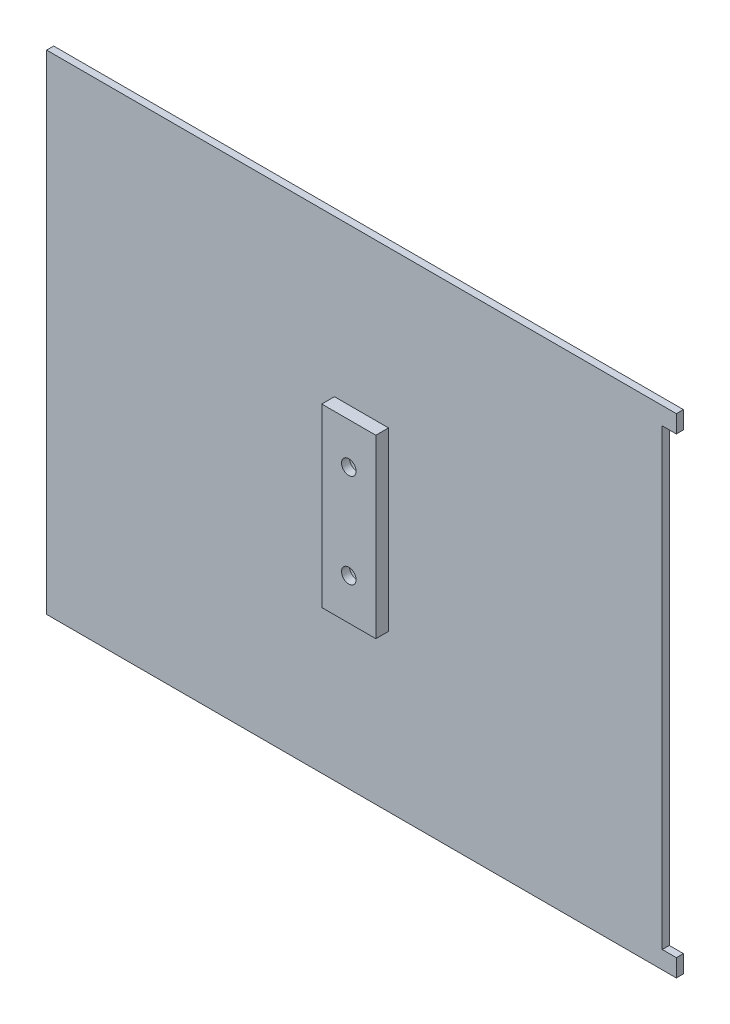
ISO-10303-21;
HEADER;
FILE_DESCRIPTION(('STEP AP214'),'2;1');
FILE_NAME('part.step','',(''),(''),'','','');
FILE_SCHEMA(('AUTOMOTIVE_DESIGN { 1 0 10303 214 1 1 1 1 }'));
ENDSEC;
DATA;
#1=APPLICATION_CONTEXT('core data for automotive mechanical design processes');
#2=APPLICATION_PROTOCOL_DEFINITION('international standard','automotive_design',2000,#1);
#3=PRODUCT_CONTEXT('',#1,'mechanical');
#4=PRODUCT('Part','Part','',(#3));
#5=PRODUCT_RELATED_PRODUCT_CATEGORY('part','',(#4));
#6=PRODUCT_DEFINITION_FORMATION('','',#4);
#7=PRODUCT_DEFINITION_CONTEXT('part definition',#1,'design');
#8=PRODUCT_DEFINITION('design','',#6,#7);
#9=PRODUCT_DEFINITION_SHAPE('','',#8);
#10=(LENGTH_UNIT() NAMED_UNIT(*) SI_UNIT(.MILLI.,.METRE.));
#11=(NAMED_UNIT(*) PLANE_ANGLE_UNIT() SI_UNIT($,.RADIAN.));
#12=(NAMED_UNIT(*) SI_UNIT($,.STERADIAN.) SOLID_ANGLE_UNIT());
#13=UNCERTAINTY_MEASURE_WITH_UNIT(LENGTH_MEASURE(1.E-05),#10,'distance_accuracy_value','');
#14=(GEOMETRIC_REPRESENTATION_CONTEXT(3) GLOBAL_UNCERTAINTY_ASSIGNED_CONTEXT((#13)) GLOBAL_UNIT_ASSIGNED_CONTEXT((#10,
#11,#12)) REPRESENTATION_CONTEXT('',''));
#15=CARTESIAN_POINT('',(0.,0.,0.));
#16=DIRECTION('',(0.,0.,1.));
#17=DIRECTION('',(1.,0.,0.));
#18=AXIS2_PLACEMENT_3D('',#15,#16,#17);
#19=CARTESIAN_POINT('',(0.,0.,1.5));
#20=DIRECTION('',(0.,0.,1.));
#21=DIRECTION('',(1.,0.,0.));
#22=AXIS2_PLACEMENT_3D('',#19,#20,#21);
#23=PLANE('',#22);
#24=DIRECTION('',(-1.,0.,0.));
#25=VECTOR('',#24,1.);
#26=CARTESIAN_POINT('',(0.,-48.2500000000001,1.5));
#27=LINE('',#26,#25);
#28=CARTESIAN_POINT('',(67.,-48.2500000000001,1.5));
#29=VERTEX_POINT('',#28);
#30=CARTESIAN_POINT('',(64.,-48.2500000000001,1.5));
#31=VERTEX_POINT('',#30);
#32=EDGE_CURVE('E161',#29,#31,#27,.T.);
#33=ORIENTED_EDGE('',*,*,#32,.T.);
#34=DIRECTION('',(0.,1.,0.));
#35=VECTOR('',#34,1.);
#36=CARTESIAN_POINT('',(64.,0.,1.5));
#37=LINE('',#36,#35);
#38=CARTESIAN_POINT('',(64.,48.2499999999999,1.5));
#39=VERTEX_POINT('',#38);
#40=EDGE_CURVE('E99',#31,#39,#37,.T.);
#41=ORIENTED_EDGE('',*,*,#40,.T.);
#42=DIRECTION('',(-1.,0.,0.));
#43=VECTOR('',#42,1.);
#44=CARTESIAN_POINT('',(0.,48.2499999999999,1.5));
#45=LINE('',#44,#43);
#46=CARTESIAN_POINT('',(67.,48.2499999999999,1.5));
#47=VERTEX_POINT('',#46);
#48=EDGE_CURVE('E174',#47,#39,#45,.T.);
#49=ORIENTED_EDGE('',*,*,#48,.F.);
#50=DIRECTION('',(0.,1.,0.));
#51=VECTOR('',#50,1.);
#52=CARTESIAN_POINT('',(67.,0.,1.5));
#53=LINE('',#52,#51);
#54=CARTESIAN_POINT('',(67.,52.,1.5));
#55=VERTEX_POINT('',#54);
#56=EDGE_CURVE('E188',#47,#55,#53,.T.);
#57=ORIENTED_EDGE('',*,*,#56,.T.);
#58=DIRECTION('',(-1.,0.,0.));
#59=VECTOR('',#58,1.);
#60=CARTESIAN_POINT('',(0.,52.,1.5));
#61=LINE('',#60,#59);
#62=CARTESIAN_POINT('',(-67.,52.,1.5));
#63=VERTEX_POINT('',#62);
#64=EDGE_CURVE('E133',#55,#63,#61,.T.);
#65=ORIENTED_EDGE('',*,*,#64,.T.);
#66=DIRECTION('',(0.,1.,0.));
#67=VECTOR('',#66,1.);
#68=CARTESIAN_POINT('',(-67.,0.,1.5));
#69=LINE('',#68,#67);
#70=CARTESIAN_POINT('',(-67.,-52.,1.5));
#71=VERTEX_POINT('',#70);
#72=EDGE_CURVE('E120',#71,#63,#69,.T.);
#73=ORIENTED_EDGE('',*,*,#72,.F.);
#74=DIRECTION('',(-1.,0.,0.));
#75=VECTOR('',#74,1.);
#76=CARTESIAN_POINT('',(0.,-52.,1.5));
#77=LINE('',#76,#75);
#78=CARTESIAN_POINT('',(67.,-52.,1.5));
#79=VERTEX_POINT('',#78);
#80=EDGE_CURVE('E131',#79,#71,#77,.T.);
#81=ORIENTED_EDGE('',*,*,#80,.F.);
#82=DIRECTION('',(0.,1.,0.));
#83=VECTOR('',#82,1.);
#84=CARTESIAN_POINT('',(67.,0.,1.5));
#85=LINE('',#84,#83);
#86=EDGE_CURVE('E58',#79,#29,#85,.T.);
#87=ORIENTED_EDGE('',*,*,#86,.T.);
#88=EDGE_LOOP('',(#33,#41,#49,#57,#65,#73,#81,#87));
#89=FACE_BOUND('',#88,.T.);
#90=DIRECTION('',(1.,0.,0.));
#91=VECTOR('',#90,1.);
#92=CARTESIAN_POINT('',(5.75,-18.75,1.5));
#93=LINE('',#92,#91);
#94=CARTESIAN_POINT('',(-5.75,-18.75,1.5));
#95=VERTEX_POINT('',#94);
#96=CARTESIAN_POINT('',(5.75,-18.75,1.5));
#97=VERTEX_POINT('',#96);
#98=EDGE_CURVE('E209',#95,#97,#93,.T.);
#99=ORIENTED_EDGE('',*,*,#98,.F.);
#100=DIRECTION('',(0.,-1.,0.));
#101=VECTOR('',#100,1.);
#102=CARTESIAN_POINT('',(-5.75,-18.75,1.5));
#103=LINE('',#102,#101);
#104=CARTESIAN_POINT('',(-5.75,18.75,1.5));
#105=VERTEX_POINT('',#104);
#106=EDGE_CURVE('E212',#105,#95,#103,.T.);
#107=ORIENTED_EDGE('',*,*,#106,.F.);
#108=DIRECTION('',(-1.,0.,0.));
#109=VECTOR('',#108,1.);
#110=CARTESIAN_POINT('',(5.75,18.75,1.5));
#111=LINE('',#110,#109);
#112=CARTESIAN_POINT('',(5.75,18.75,1.5));
#113=VERTEX_POINT('',#112);
#114=EDGE_CURVE('E204',#113,#105,#111,.T.);
#115=ORIENTED_EDGE('',*,*,#114,.F.);
#116=DIRECTION('',(0.,1.,0.));
#117=VECTOR('',#116,1.);
#118=CARTESIAN_POINT('',(5.75,-18.75,1.5));
#119=LINE('',#118,#117);
#120=EDGE_CURVE('E207',#97,#113,#119,.T.);
#121=ORIENTED_EDGE('',*,*,#120,.F.);
#122=EDGE_LOOP('',(#99,#107,#115,#121));
#123=FACE_BOUND('',#122,.T.);
#124=ADVANCED_FACE('F34',(#89,#123),#23,.T.);
#125=CARTESIAN_POINT('',(0.,-48.2500000000001,1.5));
#126=DIRECTION('',(0.,-1.,0.));
#127=DIRECTION('',(0.,0.,-1.));
#128=AXIS2_PLACEMENT_3D('',#125,#126,#127);
#129=PLANE('',#128);
#130=DIRECTION('',(-1.,0.,0.));
#131=VECTOR('',#130,1.);
#132=CARTESIAN_POINT('',(0.,-48.2500000000001,0.));
#133=LINE('',#132,#131);
#134=CARTESIAN_POINT('',(67.,-48.2500000000001,0.));
#135=VERTEX_POINT('',#134);
#136=CARTESIAN_POINT('',(64.,-48.2500000000001,0.));
#137=VERTEX_POINT('',#136);
#138=EDGE_CURVE('E142',#135,#137,#133,.T.);
#139=ORIENTED_EDGE('',*,*,#138,.T.);
#140=DIRECTION('',(0.,0.,-1.));
#141=VECTOR('',#140,1.);
#142=CARTESIAN_POINT('',(64.,-48.2500000000001,1.5));
#143=LINE('',#142,#141);
#144=EDGE_CURVE('E11',#31,#137,#143,.T.);
#145=ORIENTED_EDGE('',*,*,#144,.F.);
#146=ORIENTED_EDGE('',*,*,#32,.F.);
#147=DIRECTION('',(0.,0.,-1.));
#148=VECTOR('',#147,1.);
#149=CARTESIAN_POINT('',(67.,-48.2500000000001,1.5));
#150=LINE('',#149,#148);
#151=EDGE_CURVE('E138',#29,#135,#150,.T.);
#152=ORIENTED_EDGE('',*,*,#151,.T.);
#153=EDGE_LOOP('',(#139,#145,#146,#152));
#154=FACE_BOUND('',#153,.T.);
#155=ADVANCED_FACE('F36',(#154),#129,.F.);
#156=CARTESIAN_POINT('',(64.,0.,1.5));
#157=DIRECTION('',(-1.,0.,0.));
#158=DIRECTION('',(0.,0.,1.));
#159=AXIS2_PLACEMENT_3D('',#156,#157,#158);
#160=PLANE('',#159);
#161=DIRECTION('',(0.,1.,0.));
#162=VECTOR('',#161,1.);
#163=CARTESIAN_POINT('',(64.,0.,0.));
#164=LINE('',#163,#162);
#165=CARTESIAN_POINT('',(64.,48.2499999999999,0.));
#166=VERTEX_POINT('',#165);
#167=EDGE_CURVE('E145',#137,#166,#164,.T.);
#168=ORIENTED_EDGE('',*,*,#167,.T.);
#169=DIRECTION('',(0.,0.,-1.));
#170=VECTOR('',#169,1.);
#171=CARTESIAN_POINT('',(64.,48.2499999999999,1.5));
#172=LINE('',#171,#170);
#173=EDGE_CURVE('E42',#39,#166,#172,.T.);
#174=ORIENTED_EDGE('',*,*,#173,.F.);
#175=ORIENTED_EDGE('',*,*,#40,.F.);
#176=ORIENTED_EDGE('',*,*,#144,.T.);
#177=EDGE_LOOP('',(#168,#174,#175,#176));
#178=FACE_BOUND('',#177,.T.);
#179=ADVANCED_FACE('F175',(#178),#160,.F.);
#180=CARTESIAN_POINT('',(0.,48.2499999999999,1.5));
#181=DIRECTION('',(0.,-1.,0.));
#182=DIRECTION('',(0.,0.,-1.));
#183=AXIS2_PLACEMENT_3D('',#180,#181,#182);
#184=PLANE('',#183);
#185=DIRECTION('',(-1.,0.,0.));
#186=VECTOR('',#185,1.);
#187=CARTESIAN_POINT('',(0.,48.2499999999999,0.));
#188=LINE('',#187,#186);
#189=CARTESIAN_POINT('',(67.,48.2499999999999,0.));
#190=VERTEX_POINT('',#189);
#191=EDGE_CURVE('E149',#190,#166,#188,.T.);
#192=ORIENTED_EDGE('',*,*,#191,.F.);
#193=DIRECTION('',(0.,0.,-1.));
#194=VECTOR('',#193,1.);
#195=CARTESIAN_POINT('',(67.,48.2499999999999,1.5));
#196=LINE('',#195,#194);
#197=EDGE_CURVE('E168',#47,#190,#196,.T.);
#198=ORIENTED_EDGE('',*,*,#197,.F.);
#199=ORIENTED_EDGE('',*,*,#48,.T.);
#200=ORIENTED_EDGE('',*,*,#173,.T.);
#201=EDGE_LOOP('',(#192,#198,#199,#200));
#202=FACE_BOUND('',#201,.T.);
#203=ADVANCED_FACE('F172',(#202),#184,.T.);
#204=CARTESIAN_POINT('',(67.,0.,1.5));
#205=DIRECTION('',(-1.,0.,0.));
#206=DIRECTION('',(0.,0.,1.));
#207=AXIS2_PLACEMENT_3D('',#204,#205,#206);
#208=PLANE('',#207);
#209=DIRECTION('',(0.,1.,0.));
#210=VECTOR('',#209,1.);
#211=CARTESIAN_POINT('',(67.,0.,0.));
#212=LINE('',#211,#210);
#213=CARTESIAN_POINT('',(67.,52.,0.));
#214=VERTEX_POINT('',#213);
#215=EDGE_CURVE('E152',#190,#214,#212,.T.);
#216=ORIENTED_EDGE('',*,*,#215,.T.);
#217=DIRECTION('',(0.,0.,-1.));
#218=VECTOR('',#217,1.);
#219=CARTESIAN_POINT('',(67.,52.,1.5));
#220=LINE('',#219,#218);
#221=EDGE_CURVE('E165',#55,#214,#220,.T.);
#222=ORIENTED_EDGE('',*,*,#221,.F.);
#223=ORIENTED_EDGE('',*,*,#56,.F.);
#224=ORIENTED_EDGE('',*,*,#197,.T.);
#225=EDGE_LOOP('',(#216,#222,#223,#224));
#226=FACE_BOUND('',#225,.T.);
#227=ADVANCED_FACE('F184',(#226),#208,.F.);
#228=CARTESIAN_POINT('',(0.,52.,1.5));
#229=DIRECTION('',(0.,-1.,0.));
#230=DIRECTION('',(1.,0.,0.));
#231=AXIS2_PLACEMENT_3D('',#228,#229,#230);
#232=PLANE('',#231);
#233=DIRECTION('',(-1.,0.,0.));
#234=VECTOR('',#233,1.);
#235=CARTESIAN_POINT('',(0.,52.,0.));
#236=LINE('',#235,#234);
#237=CARTESIAN_POINT('',(-67.,52.,0.));
#238=VERTEX_POINT('',#237);
#239=EDGE_CURVE('E154',#214,#238,#236,.T.);
#240=ORIENTED_EDGE('',*,*,#239,.T.);
#241=DIRECTION('',(0.,0.,-1.));
#242=VECTOR('',#241,1.);
#243=CARTESIAN_POINT('',(-67.,52.,1.5));
#244=LINE('',#243,#242);
#245=EDGE_CURVE('E127',#63,#238,#244,.T.);
#246=ORIENTED_EDGE('',*,*,#245,.F.);
#247=ORIENTED_EDGE('',*,*,#64,.F.);
#248=ORIENTED_EDGE('',*,*,#221,.T.);
#249=EDGE_LOOP('',(#240,#246,#247,#248));
#250=FACE_BOUND('',#249,.T.);
#251=ADVANCED_FACE('F187',(#250),#232,.F.);
#252=CARTESIAN_POINT('',(-67.,0.,1.5));
#253=DIRECTION('',(-1.,0.,0.));
#254=DIRECTION('',(0.,0.,1.));
#255=AXIS2_PLACEMENT_3D('',#252,#253,#254);
#256=PLANE('',#255);
#257=DIRECTION('',(0.,1.,0.));
#258=VECTOR('',#257,1.);
#259=CARTESIAN_POINT('',(-67.,0.,0.));
#260=LINE('',#259,#258);
#261=CARTESIAN_POINT('',(-67.,-52.,0.));
#262=VERTEX_POINT('',#261);
#263=EDGE_CURVE('E122',#262,#238,#260,.T.);
#264=ORIENTED_EDGE('',*,*,#263,.F.);
#265=DIRECTION('',(0.,0.,-1.));
#266=VECTOR('',#265,1.);
#267=CARTESIAN_POINT('',(-67.,-52.,1.5));
#268=LINE('',#267,#266);
#269=EDGE_CURVE('E117',#71,#262,#268,.T.);
#270=ORIENTED_EDGE('',*,*,#269,.F.);
#271=ORIENTED_EDGE('',*,*,#72,.T.);
#272=ORIENTED_EDGE('',*,*,#245,.T.);
#273=EDGE_LOOP('',(#264,#270,#271,#272));
#274=FACE_BOUND('',#273,.T.);
#275=ADVANCED_FACE('F119',(#274),#256,.T.);
#276=CARTESIAN_POINT('',(0.,-52.,1.5));
#277=DIRECTION('',(0.,-1.,0.));
#278=DIRECTION('',(1.,0.,0.));
#279=AXIS2_PLACEMENT_3D('',#276,#277,#278);
#280=PLANE('',#279);
#281=DIRECTION('',(-1.,0.,0.));
#282=VECTOR('',#281,1.);
#283=CARTESIAN_POINT('',(0.,-52.,0.));
#284=LINE('',#283,#282);
#285=CARTESIAN_POINT('',(67.,-52.,0.));
#286=VERTEX_POINT('',#285);
#287=EDGE_CURVE('E158',#286,#262,#284,.T.);
#288=ORIENTED_EDGE('',*,*,#287,.F.);
#289=DIRECTION('',(0.,0.,-1.));
#290=VECTOR('',#289,1.);
#291=CARTESIAN_POINT('',(67.,-52.,1.5));
#292=LINE('',#291,#290);
#293=EDGE_CURVE('E128',#79,#286,#292,.T.);
#294=ORIENTED_EDGE('',*,*,#293,.F.);
#295=ORIENTED_EDGE('',*,*,#80,.T.);
#296=ORIENTED_EDGE('',*,*,#269,.T.);
#297=EDGE_LOOP('',(#288,#294,#295,#296));
#298=FACE_BOUND('',#297,.T.);
#299=ADVANCED_FACE('F136',(#298),#280,.T.);
#300=CARTESIAN_POINT('',(67.,0.,1.5));
#301=DIRECTION('',(-1.,0.,0.));
#302=DIRECTION('',(0.,0.,1.));
#303=AXIS2_PLACEMENT_3D('',#300,#301,#302);
#304=PLANE('',#303);
#305=DIRECTION('',(0.,1.,0.));
#306=VECTOR('',#305,1.);
#307=CARTESIAN_POINT('',(67.,0.,0.));
#308=LINE('',#307,#306);
#309=EDGE_CURVE('E91',#286,#135,#308,.T.);
#310=ORIENTED_EDGE('',*,*,#309,.T.);
#311=ORIENTED_EDGE('',*,*,#151,.F.);
#312=ORIENTED_EDGE('',*,*,#86,.F.);
#313=ORIENTED_EDGE('',*,*,#293,.T.);
#314=EDGE_LOOP('',(#310,#311,#312,#313));
#315=FACE_BOUND('',#314,.T.);
#316=ADVANCED_FACE('F269',(#315),#304,.F.);
#317=CARTESIAN_POINT('',(0.,0.,0.));
#318=DIRECTION('',(0.,0.,1.));
#319=DIRECTION('',(1.,0.,0.));
#320=AXIS2_PLACEMENT_3D('',#317,#318,#319);
#321=PLANE('',#320);
#322=CARTESIAN_POINT('',(0.,10.,0.));
#323=DIRECTION('',(0.,0.,-1.));
#324=DIRECTION('',(-1.,0.,0.));
#325=AXIS2_PLACEMENT_3D('',#322,#323,#324);
#326=CIRCLE('',#325,3.1);
#327=CARTESIAN_POINT('',(-3.1,10.,0.));
#328=VERTEX_POINT('',#327);
#329=EDGE_CURVE('E232',#328,#328,#326,.T.);
#330=ORIENTED_EDGE('',*,*,#329,.F.);
#331=EDGE_LOOP('',(#330));
#332=FACE_BOUND('',#331,.T.);
#333=CARTESIAN_POINT('',(0.,-10.,0.));
#334=DIRECTION('',(0.,0.,-1.));
#335=DIRECTION('',(-1.,0.,0.));
#336=AXIS2_PLACEMENT_3D('',#333,#334,#335);
#337=CIRCLE('',#336,3.1);
#338=CARTESIAN_POINT('',(-3.1,-10.,0.));
#339=VERTEX_POINT('',#338);
#340=EDGE_CURVE('E226',#339,#339,#337,.T.);
#341=ORIENTED_EDGE('',*,*,#340,.F.);
#342=EDGE_LOOP('',(#341));
#343=FACE_BOUND('',#342,.T.);
#344=ORIENTED_EDGE('',*,*,#138,.F.);
#345=ORIENTED_EDGE('',*,*,#309,.F.);
#346=ORIENTED_EDGE('',*,*,#287,.T.);
#347=ORIENTED_EDGE('',*,*,#263,.T.);
#348=ORIENTED_EDGE('',*,*,#239,.F.);
#349=ORIENTED_EDGE('',*,*,#215,.F.);
#350=ORIENTED_EDGE('',*,*,#191,.T.);
#351=ORIENTED_EDGE('',*,*,#167,.F.);
#352=EDGE_LOOP('',(#344,#345,#346,#347,#348,#349,#350,#351));
#353=FACE_BOUND('',#352,.T.);
#354=ADVANCED_FACE('F180',(#332,#343,#353),#321,.F.);
#355=CARTESIAN_POINT('',(-5.75,-18.75,4.2));
#356=DIRECTION('',(1.,0.,0.));
#357=DIRECTION('',(0.,0.,-1.));
#358=AXIS2_PLACEMENT_3D('',#355,#356,#357);
#359=PLANE('',#358);
#360=ORIENTED_EDGE('',*,*,#106,.T.);
#361=DIRECTION('',(0.,0.,-1.));
#362=VECTOR('',#361,1.);
#363=CARTESIAN_POINT('',(-5.75,-18.75,4.2));
#364=LINE('',#363,#362);
#365=CARTESIAN_POINT('',(-5.75,-18.75,4.2));
#366=VERTEX_POINT('',#365);
#367=EDGE_CURVE('E146',#366,#95,#364,.T.);
#368=ORIENTED_EDGE('',*,*,#367,.F.);
#369=DIRECTION('',(0.,-1.,0.));
#370=VECTOR('',#369,1.);
#371=CARTESIAN_POINT('',(-5.75,-18.75,4.2));
#372=LINE('',#371,#370);
#373=CARTESIAN_POINT('',(-5.75,18.75,4.2));
#374=VERTEX_POINT('',#373);
#375=EDGE_CURVE('E206',#374,#366,#372,.T.);
#376=ORIENTED_EDGE('',*,*,#375,.F.);
#377=DIRECTION('',(0.,0.,-1.));
#378=VECTOR('',#377,1.);
#379=CARTESIAN_POINT('',(-5.75,18.75,4.2));
#380=LINE('',#379,#378);
#381=EDGE_CURVE('E200',#374,#105,#380,.T.);
#382=ORIENTED_EDGE('',*,*,#381,.T.);
#383=EDGE_LOOP('',(#360,#368,#376,#382));
#384=FACE_BOUND('',#383,.T.);
#385=ADVANCED_FACE('F268',(#384),#359,.F.);
#386=CARTESIAN_POINT('',(5.75,-18.75,4.2));
#387=DIRECTION('',(0.,1.,0.));
#388=DIRECTION('',(0.,0.,1.));
#389=AXIS2_PLACEMENT_3D('',#386,#387,#388);
#390=PLANE('',#389);
#391=ORIENTED_EDGE('',*,*,#98,.T.);
#392=DIRECTION('',(0.,0.,-1.));
#393=VECTOR('',#392,1.);
#394=CARTESIAN_POINT('',(5.75,-18.75,4.2));
#395=LINE('',#394,#393);
#396=CARTESIAN_POINT('',(5.75,-18.75,4.2));
#397=VERTEX_POINT('',#396);
#398=EDGE_CURVE('E196',#397,#97,#395,.T.);
#399=ORIENTED_EDGE('',*,*,#398,.F.);
#400=DIRECTION('',(1.,0.,0.));
#401=VECTOR('',#400,1.);
#402=CARTESIAN_POINT('',(5.75,-18.75,4.2));
#403=LINE('',#402,#401);
#404=EDGE_CURVE('E221',#366,#397,#403,.T.);
#405=ORIENTED_EDGE('',*,*,#404,.F.);
#406=ORIENTED_EDGE('',*,*,#367,.T.);
#407=EDGE_LOOP('',(#391,#399,#405,#406));
#408=FACE_BOUND('',#407,.T.);
#409=ADVANCED_FACE('F348',(#408),#390,.F.);
#410=CARTESIAN_POINT('',(5.75,-18.75,4.2));
#411=DIRECTION('',(-1.,0.,0.));
#412=DIRECTION('',(0.,0.,1.));
#413=AXIS2_PLACEMENT_3D('',#410,#411,#412);
#414=PLANE('',#413);
#415=ORIENTED_EDGE('',*,*,#120,.T.);
#416=DIRECTION('',(0.,0.,-1.));
#417=VECTOR('',#416,1.);
#418=CARTESIAN_POINT('',(5.75,18.75,4.2));
#419=LINE('',#418,#417);
#420=CARTESIAN_POINT('',(5.75,18.75,4.2));
#421=VERTEX_POINT('',#420);
#422=EDGE_CURVE('E49',#421,#113,#419,.T.);
#423=ORIENTED_EDGE('',*,*,#422,.F.);
#424=DIRECTION('',(0.,1.,0.));
#425=VECTOR('',#424,1.);
#426=CARTESIAN_POINT('',(5.75,-18.75,4.2));
#427=LINE('',#426,#425);
#428=EDGE_CURVE('E218',#397,#421,#427,.T.);
#429=ORIENTED_EDGE('',*,*,#428,.F.);
#430=ORIENTED_EDGE('',*,*,#398,.T.);
#431=EDGE_LOOP('',(#415,#423,#429,#430));
#432=FACE_BOUND('',#431,.T.);
#433=ADVANCED_FACE('F355',(#432),#414,.F.);
#434=CARTESIAN_POINT('',(5.75,18.75,4.2));
#435=DIRECTION('',(0.,-1.,0.));
#436=DIRECTION('',(1.,0.,0.));
#437=AXIS2_PLACEMENT_3D('',#434,#435,#436);
#438=PLANE('',#437);
#439=ORIENTED_EDGE('',*,*,#114,.T.);
#440=ORIENTED_EDGE('',*,*,#381,.F.);
#441=DIRECTION('',(-1.,0.,0.));
#442=VECTOR('',#441,1.);
#443=CARTESIAN_POINT('',(5.75,18.75,4.2));
#444=LINE('',#443,#442);
#445=EDGE_CURVE('E203',#421,#374,#444,.T.);
#446=ORIENTED_EDGE('',*,*,#445,.F.);
#447=ORIENTED_EDGE('',*,*,#422,.T.);
#448=EDGE_LOOP('',(#439,#440,#446,#447));
#449=FACE_BOUND('',#448,.T.);
#450=ADVANCED_FACE('F284',(#449),#438,.F.);
#451=CARTESIAN_POINT('',(0.,0.,4.2));
#452=DIRECTION('',(0.,0.,1.));
#453=DIRECTION('',(1.,0.,0.));
#454=AXIS2_PLACEMENT_3D('',#451,#452,#453);
#455=PLANE('',#454);
#456=CARTESIAN_POINT('',(0.,10.,4.2));
#457=DIRECTION('',(0.,0.,1.));
#458=DIRECTION('',(1.,0.,0.));
#459=AXIS2_PLACEMENT_3D('',#456,#457,#458);
#460=CIRCLE('',#459,1.55);
#461=CARTESIAN_POINT('',(1.55,10.,4.2));
#462=VERTEX_POINT('',#461);
#463=EDGE_CURVE('E243',#462,#462,#460,.T.);
#464=ORIENTED_EDGE('',*,*,#463,.F.);
#465=EDGE_LOOP('',(#464));
#466=FACE_BOUND('',#465,.T.);
#467=CARTESIAN_POINT('',(0.,-10.,4.2));
#468=DIRECTION('',(0.,0.,1.));
#469=DIRECTION('',(1.,0.,0.));
#470=AXIS2_PLACEMENT_3D('',#467,#468,#469);
#471=CIRCLE('',#470,1.55);
#472=CARTESIAN_POINT('',(1.55,-10.,4.2));
#473=VERTEX_POINT('',#472);
#474=EDGE_CURVE('E235',#473,#473,#471,.T.);
#475=ORIENTED_EDGE('',*,*,#474,.F.);
#476=EDGE_LOOP('',(#475));
#477=FACE_BOUND('',#476,.T.);
#478=ORIENTED_EDGE('',*,*,#375,.T.);
#479=ORIENTED_EDGE('',*,*,#404,.T.);
#480=ORIENTED_EDGE('',*,*,#428,.T.);
#481=ORIENTED_EDGE('',*,*,#445,.T.);
#482=EDGE_LOOP('',(#478,#479,#480,#481));
#483=FACE_BOUND('',#482,.T.);
#484=ADVANCED_FACE('F275',(#466,#477,#483),#455,.T.);
#485=CARTESIAN_POINT('',(0.,-10.,2.5));
#486=DIRECTION('',(0.,0.,-1.));
#487=DIRECTION('',(-1.,0.,0.));
#488=AXIS2_PLACEMENT_3D('',#485,#486,#487);
#489=CYLINDRICAL_SURFACE('',#488,3.1);
#490=CARTESIAN_POINT('',(0.,-10.,2.5));
#491=DIRECTION('',(0.,0.,-1.));
#492=DIRECTION('',(-1.,0.,0.));
#493=AXIS2_PLACEMENT_3D('',#490,#491,#492);
#494=CIRCLE('',#493,3.1);
#495=CARTESIAN_POINT('',(-3.1,-10.,2.5));
#496=VERTEX_POINT('',#495);
#497=EDGE_CURVE('E215',#496,#496,#494,.T.);
#498=ORIENTED_EDGE('',*,*,#497,.F.);
#499=EDGE_LOOP('',(#498));
#500=FACE_BOUND('',#499,.T.);
#501=ORIENTED_EDGE('',*,*,#340,.T.);
#502=EDGE_LOOP('',(#501));
#503=FACE_BOUND('',#502,.T.);
#504=ADVANCED_FACE('F273',(#500,#503),#489,.F.);
#505=CARTESIAN_POINT('',(0.,-10.,2.5));
#506=DIRECTION('',(0.,0.,-1.));
#507=DIRECTION('',(-1.,0.,0.));
#508=AXIS2_PLACEMENT_3D('',#505,#506,#507);
#509=PLANE('',#508);
#510=CARTESIAN_POINT('',(0.,-10.,2.5));
#511=DIRECTION('',(0.,0.,-1.));
#512=DIRECTION('',(-1.,0.,0.));
#513=AXIS2_PLACEMENT_3D('',#510,#511,#512);
#514=CIRCLE('',#513,1.55);
#515=CARTESIAN_POINT('',(-1.55,-10.,2.5));
#516=VERTEX_POINT('',#515);
#517=EDGE_CURVE('E240',#516,#516,#514,.T.);
#518=ORIENTED_EDGE('',*,*,#517,.F.);
#519=EDGE_LOOP('',(#518));
#520=FACE_BOUND('',#519,.T.);
#521=ORIENTED_EDGE('',*,*,#497,.T.);
#522=EDGE_LOOP('',(#521));
#523=FACE_BOUND('',#522,.T.);
#524=ADVANCED_FACE('F262',(#520,#523),#509,.T.);
#525=CARTESIAN_POINT('',(0.,10.,2.5));
#526=DIRECTION('',(0.,0.,-1.));
#527=DIRECTION('',(-1.,0.,0.));
#528=AXIS2_PLACEMENT_3D('',#525,#526,#527);
#529=CYLINDRICAL_SURFACE('',#528,3.1);
#530=CARTESIAN_POINT('',(0.,10.,2.5));
#531=DIRECTION('',(0.,0.,-1.));
#532=DIRECTION('',(-1.,0.,0.));
#533=AXIS2_PLACEMENT_3D('',#530,#531,#532);
#534=CIRCLE('',#533,3.1);
#535=CARTESIAN_POINT('',(-3.1,10.,2.5));
#536=VERTEX_POINT('',#535);
#537=EDGE_CURVE('E229',#536,#536,#534,.T.);
#538=ORIENTED_EDGE('',*,*,#537,.F.);
#539=EDGE_LOOP('',(#538));
#540=FACE_BOUND('',#539,.T.);
#541=ORIENTED_EDGE('',*,*,#329,.T.);
#542=EDGE_LOOP('',(#541));
#543=FACE_BOUND('',#542,.T.);
#544=ADVANCED_FACE('F256',(#540,#543),#529,.F.);
#545=CARTESIAN_POINT('',(0.,10.,2.5));
#546=DIRECTION('',(0.,0.,-1.));
#547=DIRECTION('',(-1.,0.,0.));
#548=AXIS2_PLACEMENT_3D('',#545,#546,#547);
#549=PLANE('',#548);
#550=CARTESIAN_POINT('',(0.,10.,2.5));
#551=DIRECTION('',(0.,0.,-1.));
#552=DIRECTION('',(-1.,0.,0.));
#553=AXIS2_PLACEMENT_3D('',#550,#551,#552);
#554=CIRCLE('',#553,1.55);
#555=CARTESIAN_POINT('',(-1.55,10.,2.5));
#556=VERTEX_POINT('',#555);
#557=EDGE_CURVE('E246',#556,#556,#554,.T.);
#558=ORIENTED_EDGE('',*,*,#557,.F.);
#559=EDGE_LOOP('',(#558));
#560=FACE_BOUND('',#559,.T.);
#561=ORIENTED_EDGE('',*,*,#537,.T.);
#562=EDGE_LOOP('',(#561));
#563=FACE_BOUND('',#562,.T.);
#564=ADVANCED_FACE('F252',(#560,#563),#549,.T.);
#565=CARTESIAN_POINT('',(0.,-10.,5.));
#566=DIRECTION('',(0.,0.,-1.));
#567=DIRECTION('',(-1.,0.,0.));
#568=AXIS2_PLACEMENT_3D('',#565,#566,#567);
#569=CYLINDRICAL_SURFACE('',#568,1.55);
#570=ORIENTED_EDGE('',*,*,#474,.T.);
#571=EDGE_LOOP('',(#570));
#572=FACE_BOUND('',#571,.T.);
#573=ORIENTED_EDGE('',*,*,#517,.T.);
#574=EDGE_LOOP('',(#573));
#575=FACE_BOUND('',#574,.T.);
#576=ADVANCED_FACE('F255',(#572,#575),#569,.F.);
#577=CARTESIAN_POINT('',(0.,10.,5.));
#578=DIRECTION('',(0.,0.,-1.));
#579=DIRECTION('',(-1.,0.,0.));
#580=AXIS2_PLACEMENT_3D('',#577,#578,#579);
#581=CYLINDRICAL_SURFACE('',#580,1.55);
#582=ORIENTED_EDGE('',*,*,#463,.T.);
#583=EDGE_LOOP('',(#582));
#584=FACE_BOUND('',#583,.T.);
#585=ORIENTED_EDGE('',*,*,#557,.T.);
#586=EDGE_LOOP('',(#585));
#587=FACE_BOUND('',#586,.T.);
#588=ADVANCED_FACE('F250',(#584,#587),#581,.F.);
#589=CLOSED_SHELL('',(#124,#155,#179,#203,#227,#251,#275,#299,#316,#354,#385,#409,#433,#450,
#484,#504,#524,#544,#564,#576,#588));
#590=MANIFOLD_SOLID_BREP('B2',#589);
#591=ADVANCED_BREP_SHAPE_REPRESENTATION('',(#18,#590),#14);
#592=SHAPE_DEFINITION_REPRESENTATION(#9,#591);
ENDSEC;
END-ISO-10303-21;
